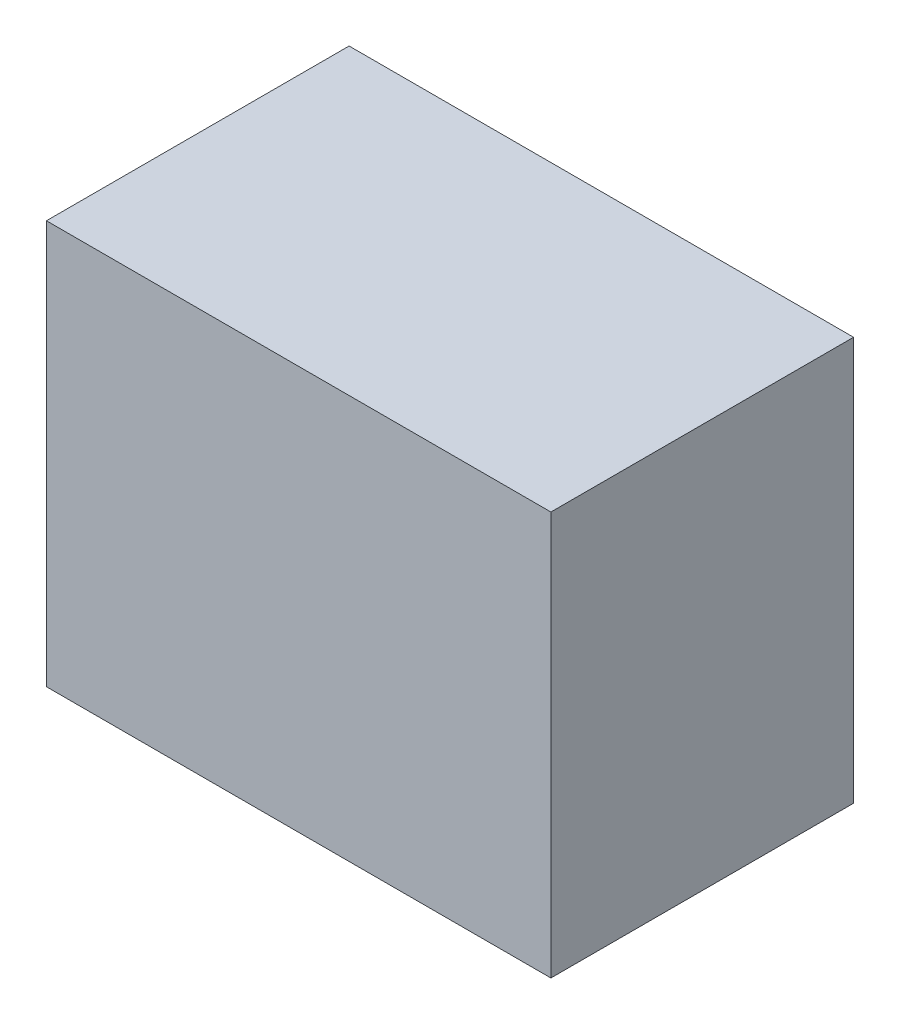
ISO-10303-21;
HEADER;
FILE_DESCRIPTION(('STEP AP214'),'2;1');
FILE_NAME('part.step','',(''),(''),'','','');
FILE_SCHEMA(('AUTOMOTIVE_DESIGN { 1 0 10303 214 1 1 1 1 }'));
ENDSEC;
DATA;
#1=APPLICATION_CONTEXT('core data for automotive mechanical design processes');
#2=APPLICATION_PROTOCOL_DEFINITION('international standard','automotive_design',2000,#1);
#3=PRODUCT_CONTEXT('',#1,'mechanical');
#4=PRODUCT('Part','Part','',(#3));
#5=PRODUCT_RELATED_PRODUCT_CATEGORY('part','',(#4));
#6=PRODUCT_DEFINITION_FORMATION('','',#4);
#7=PRODUCT_DEFINITION_CONTEXT('part definition',#1,'design');
#8=PRODUCT_DEFINITION('design','',#6,#7);
#9=PRODUCT_DEFINITION_SHAPE('','',#8);
#10=(LENGTH_UNIT() NAMED_UNIT(*) SI_UNIT(.MILLI.,.METRE.));
#11=(NAMED_UNIT(*) PLANE_ANGLE_UNIT() SI_UNIT($,.RADIAN.));
#12=(NAMED_UNIT(*) SI_UNIT($,.STERADIAN.) SOLID_ANGLE_UNIT());
#13=UNCERTAINTY_MEASURE_WITH_UNIT(LENGTH_MEASURE(1.E-05),#10,'distance_accuracy_value','');
#14=(GEOMETRIC_REPRESENTATION_CONTEXT(3) GLOBAL_UNCERTAINTY_ASSIGNED_CONTEXT((#13)) GLOBAL_UNIT_ASSIGNED_CONTEXT((#10,
#11,#12)) REPRESENTATION_CONTEXT('',''));
#15=CARTESIAN_POINT('',(0.,0.,0.));
#16=DIRECTION('',(0.,0.,1.));
#17=DIRECTION('',(1.,0.,0.));
#18=AXIS2_PLACEMENT_3D('',#15,#16,#17);
#19=CARTESIAN_POINT('',(6.25,10.,-3.75));
#20=DIRECTION('',(-1.,0.,0.));
#21=DIRECTION('',(0.,0.,1.));
#22=AXIS2_PLACEMENT_3D('',#19,#20,#21);
#23=PLANE('',#22);
#24=DIRECTION('',(0.,0.,-1.));
#25=VECTOR('',#24,1.);
#26=CARTESIAN_POINT('',(6.25,0.,-3.75));
#27=LINE('',#26,#25);
#28=CARTESIAN_POINT('',(6.25,0.,3.75));
#29=VERTEX_POINT('',#28);
#30=CARTESIAN_POINT('',(6.25,0.,-3.75));
#31=VERTEX_POINT('',#30);
#32=EDGE_CURVE('E94',#29,#31,#27,.T.);
#33=ORIENTED_EDGE('',*,*,#32,.T.);
#34=DIRECTION('',(0.,-1.,0.));
#35=VECTOR('',#34,1.);
#36=CARTESIAN_POINT('',(6.25,10.,-3.75));
#37=LINE('',#36,#35);
#38=CARTESIAN_POINT('',(6.25,10.,-3.75));
#39=VERTEX_POINT('',#38);
#40=EDGE_CURVE('E11',#39,#31,#37,.T.);
#41=ORIENTED_EDGE('',*,*,#40,.F.);
#42=DIRECTION('',(0.,0.,-1.));
#43=VECTOR('',#42,1.);
#44=CARTESIAN_POINT('',(6.25,10.,-3.75));
#45=LINE('',#44,#43);
#46=CARTESIAN_POINT('',(6.25,10.,3.75));
#47=VERTEX_POINT('',#46);
#48=EDGE_CURVE('E82',#47,#39,#45,.T.);
#49=ORIENTED_EDGE('',*,*,#48,.F.);
#50=DIRECTION('',(0.,-1.,0.));
#51=VECTOR('',#50,1.);
#52=CARTESIAN_POINT('',(6.25,10.,3.75));
#53=LINE('',#52,#51);
#54=EDGE_CURVE('E90',#47,#29,#53,.T.);
#55=ORIENTED_EDGE('',*,*,#54,.T.);
#56=EDGE_LOOP('',(#33,#41,#49,#55));
#57=FACE_BOUND('',#56,.T.);
#58=ADVANCED_FACE('F31',(#57),#23,.F.);
#59=CARTESIAN_POINT('',(-6.25,10.,-3.75));
#60=DIRECTION('',(0.,0.,1.));
#61=DIRECTION('',(1.,0.,0.));
#62=AXIS2_PLACEMENT_3D('',#59,#60,#61);
#63=PLANE('',#62);
#64=DIRECTION('',(-1.,0.,0.));
#65=VECTOR('',#64,1.);
#66=CARTESIAN_POINT('',(-6.25,0.,-3.75));
#67=LINE('',#66,#65);
#68=CARTESIAN_POINT('',(-6.25,0.,-3.75));
#69=VERTEX_POINT('',#68);
#70=EDGE_CURVE('E86',#31,#69,#67,.T.);
#71=ORIENTED_EDGE('',*,*,#70,.T.);
#72=DIRECTION('',(0.,-1.,0.));
#73=VECTOR('',#72,1.);
#74=CARTESIAN_POINT('',(-6.25,10.,-3.75));
#75=LINE('',#74,#73);
#76=CARTESIAN_POINT('',(-6.25,10.,-3.75));
#77=VERTEX_POINT('',#76);
#78=EDGE_CURVE('E39',#77,#69,#75,.T.);
#79=ORIENTED_EDGE('',*,*,#78,.F.);
#80=DIRECTION('',(-1.,0.,0.));
#81=VECTOR('',#80,1.);
#82=CARTESIAN_POINT('',(-6.25,10.,-3.75));
#83=LINE('',#82,#81);
#84=EDGE_CURVE('E77',#39,#77,#83,.T.);
#85=ORIENTED_EDGE('',*,*,#84,.F.);
#86=ORIENTED_EDGE('',*,*,#40,.T.);
#87=EDGE_LOOP('',(#71,#79,#85,#86));
#88=FACE_BOUND('',#87,.T.);
#89=ADVANCED_FACE('F85',(#88),#63,.F.);
#90=CARTESIAN_POINT('',(-6.25,10.,-3.75));
#91=DIRECTION('',(1.,0.,0.));
#92=DIRECTION('',(0.,0.,-1.));
#93=AXIS2_PLACEMENT_3D('',#90,#91,#92);
#94=PLANE('',#93);
#95=DIRECTION('',(0.,0.,1.));
#96=VECTOR('',#95,1.);
#97=CARTESIAN_POINT('',(-6.25,0.,-3.75));
#98=LINE('',#97,#96);
#99=CARTESIAN_POINT('',(-6.25,0.,3.75));
#100=VERTEX_POINT('',#99);
#101=EDGE_CURVE('E64',#69,#100,#98,.T.);
#102=ORIENTED_EDGE('',*,*,#101,.T.);
#103=DIRECTION('',(0.,-1.,0.));
#104=VECTOR('',#103,1.);
#105=CARTESIAN_POINT('',(-6.25,10.,3.75));
#106=LINE('',#105,#104);
#107=CARTESIAN_POINT('',(-6.25,10.,3.75));
#108=VERTEX_POINT('',#107);
#109=EDGE_CURVE('E87',#108,#100,#106,.T.);
#110=ORIENTED_EDGE('',*,*,#109,.F.);
#111=DIRECTION('',(0.,0.,1.));
#112=VECTOR('',#111,1.);
#113=CARTESIAN_POINT('',(-6.25,10.,-3.75));
#114=LINE('',#113,#112);
#115=EDGE_CURVE('E80',#77,#108,#114,.T.);
#116=ORIENTED_EDGE('',*,*,#115,.F.);
#117=ORIENTED_EDGE('',*,*,#78,.T.);
#118=EDGE_LOOP('',(#102,#110,#116,#117));
#119=FACE_BOUND('',#118,.T.);
#120=ADVANCED_FACE('F88',(#119),#94,.F.);
#121=CARTESIAN_POINT('',(-6.25,10.,3.75));
#122=DIRECTION('',(0.,0.,-1.));
#123=DIRECTION('',(-1.,0.,0.));
#124=AXIS2_PLACEMENT_3D('',#121,#122,#123);
#125=PLANE('',#124);
#126=DIRECTION('',(1.,0.,0.));
#127=VECTOR('',#126,1.);
#128=CARTESIAN_POINT('',(-6.25,0.,3.75));
#129=LINE('',#128,#127);
#130=EDGE_CURVE('E70',#100,#29,#129,.T.);
#131=ORIENTED_EDGE('',*,*,#130,.T.);
#132=ORIENTED_EDGE('',*,*,#54,.F.);
#133=DIRECTION('',(1.,0.,0.));
#134=VECTOR('',#133,1.);
#135=CARTESIAN_POINT('',(-6.25,10.,3.75));
#136=LINE('',#135,#134);
#137=EDGE_CURVE('E47',#108,#47,#136,.T.);
#138=ORIENTED_EDGE('',*,*,#137,.F.);
#139=ORIENTED_EDGE('',*,*,#109,.T.);
#140=EDGE_LOOP('',(#131,#132,#138,#139));
#141=FACE_BOUND('',#140,.T.);
#142=ADVANCED_FACE('F101',(#141),#125,.F.);
#143=CARTESIAN_POINT('',(6.25,10.,3.75));
#144=DIRECTION('',(0.,1.,0.));
#145=DIRECTION('',(0.,0.,1.));
#146=AXIS2_PLACEMENT_3D('',#143,#144,#145);
#147=PLANE('',#146);
#148=ORIENTED_EDGE('',*,*,#48,.T.);
#149=ORIENTED_EDGE('',*,*,#84,.T.);
#150=ORIENTED_EDGE('',*,*,#115,.T.);
#151=ORIENTED_EDGE('',*,*,#137,.T.);
#152=EDGE_LOOP('',(#148,#149,#150,#151));
#153=FACE_BOUND('',#152,.T.);
#154=ADVANCED_FACE('F78',(#153),#147,.T.);
#155=CARTESIAN_POINT('',(6.25,0.,3.75));
#156=DIRECTION('',(0.,1.,0.));
#157=DIRECTION('',(0.,0.,1.));
#158=AXIS2_PLACEMENT_3D('',#155,#156,#157);
#159=PLANE('',#158);
#160=ORIENTED_EDGE('',*,*,#32,.F.);
#161=ORIENTED_EDGE('',*,*,#130,.F.);
#162=ORIENTED_EDGE('',*,*,#101,.F.);
#163=ORIENTED_EDGE('',*,*,#70,.F.);
#164=EDGE_LOOP('',(#160,#161,#162,#163));
#165=FACE_BOUND('',#164,.T.);
#166=ADVANCED_FACE('F104',(#165),#159,.F.);
#167=CLOSED_SHELL('',(#58,#89,#120,#142,#154,#166));
#168=MANIFOLD_SOLID_BREP('B2',#167);
#169=ADVANCED_BREP_SHAPE_REPRESENTATION('',(#18,#168),#14);
#170=SHAPE_DEFINITION_REPRESENTATION(#9,#169);
ENDSEC;
END-ISO-10303-21;
